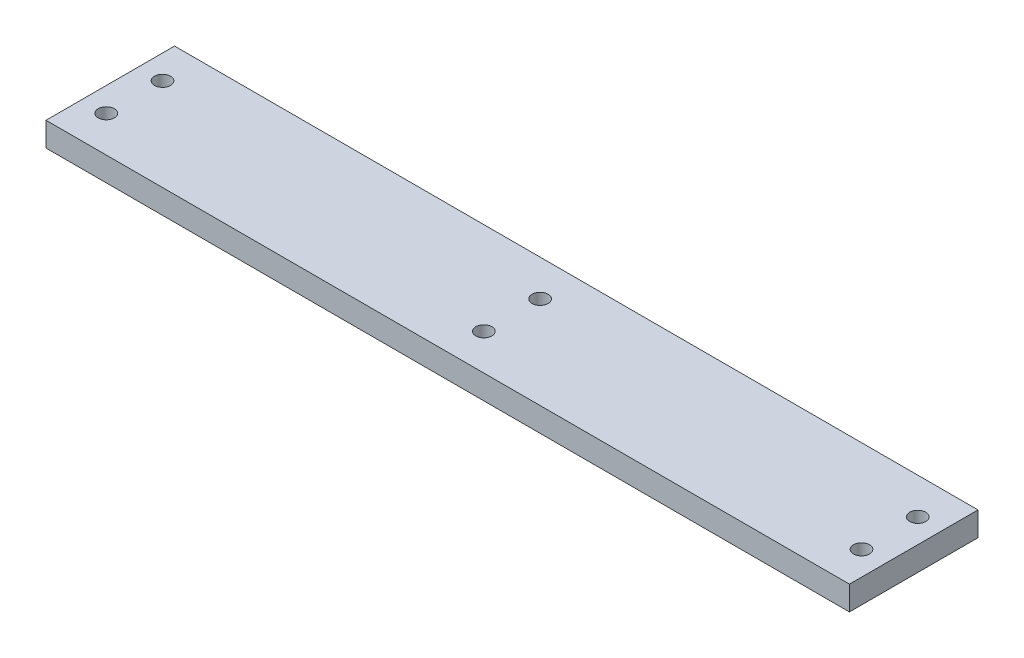
ISO-10303-21;
HEADER;
FILE_DESCRIPTION(('STEP AP214'),'2;1');
FILE_NAME('part.step','',(''),(''),'','','');
FILE_SCHEMA(('AUTOMOTIVE_DESIGN { 1 0 10303 214 1 1 1 1 }'));
ENDSEC;
DATA;
#1=APPLICATION_CONTEXT('core data for automotive mechanical design processes');
#2=APPLICATION_PROTOCOL_DEFINITION('international standard','automotive_design',2000,#1);
#3=PRODUCT_CONTEXT('',#1,'mechanical');
#4=PRODUCT('Part','Part','',(#3));
#5=PRODUCT_RELATED_PRODUCT_CATEGORY('part','',(#4));
#6=PRODUCT_DEFINITION_FORMATION('','',#4);
#7=PRODUCT_DEFINITION_CONTEXT('part definition',#1,'design');
#8=PRODUCT_DEFINITION('design','',#6,#7);
#9=PRODUCT_DEFINITION_SHAPE('','',#8);
#10=(LENGTH_UNIT() NAMED_UNIT(*) SI_UNIT(.MILLI.,.METRE.));
#11=(NAMED_UNIT(*) PLANE_ANGLE_UNIT() SI_UNIT($,.RADIAN.));
#12=(NAMED_UNIT(*) SI_UNIT($,.STERADIAN.) SOLID_ANGLE_UNIT());
#13=UNCERTAINTY_MEASURE_WITH_UNIT(LENGTH_MEASURE(1.E-05),#10,'distance_accuracy_value','');
#14=(GEOMETRIC_REPRESENTATION_CONTEXT(3) GLOBAL_UNCERTAINTY_ASSIGNED_CONTEXT((#13)) GLOBAL_UNIT_ASSIGNED_CONTEXT((#10,
#11,#12)) REPRESENTATION_CONTEXT('',''));
#15=CARTESIAN_POINT('',(0.,0.,0.));
#16=DIRECTION('',(0.,0.,1.));
#17=DIRECTION('',(1.,0.,0.));
#18=AXIS2_PLACEMENT_3D('',#15,#16,#17);
#19=CARTESIAN_POINT('',(50.,3.,8.));
#20=DIRECTION('',(-1.,0.,0.));
#21=DIRECTION('',(0.,0.,1.));
#22=AXIS2_PLACEMENT_3D('',#19,#20,#21);
#23=PLANE('',#22);
#24=DIRECTION('',(0.,0.,-1.));
#25=VECTOR('',#24,1.);
#26=CARTESIAN_POINT('',(50.,0.,8.));
#27=LINE('',#26,#25);
#28=CARTESIAN_POINT('',(50.,0.,8.));
#29=VERTEX_POINT('',#28);
#30=CARTESIAN_POINT('',(50.,0.,-8.));
#31=VERTEX_POINT('',#30);
#32=EDGE_CURVE('E97',#29,#31,#27,.T.);
#33=ORIENTED_EDGE('',*,*,#32,.T.);
#34=DIRECTION('',(0.,-1.,0.));
#35=VECTOR('',#34,1.);
#36=CARTESIAN_POINT('',(50.,3.,-8.));
#37=LINE('',#36,#35);
#38=CARTESIAN_POINT('',(50.,3.,-8.));
#39=VERTEX_POINT('',#38);
#40=EDGE_CURVE('E11',#39,#31,#37,.T.);
#41=ORIENTED_EDGE('',*,*,#40,.F.);
#42=DIRECTION('',(0.,0.,-1.));
#43=VECTOR('',#42,1.);
#44=CARTESIAN_POINT('',(50.,3.,8.));
#45=LINE('',#44,#43);
#46=CARTESIAN_POINT('',(50.,3.,8.));
#47=VERTEX_POINT('',#46);
#48=EDGE_CURVE('E85',#47,#39,#45,.T.);
#49=ORIENTED_EDGE('',*,*,#48,.F.);
#50=DIRECTION('',(0.,-1.,0.));
#51=VECTOR('',#50,1.);
#52=CARTESIAN_POINT('',(50.,3.,8.));
#53=LINE('',#52,#51);
#54=EDGE_CURVE('E93',#47,#29,#53,.T.);
#55=ORIENTED_EDGE('',*,*,#54,.T.);
#56=EDGE_LOOP('',(#33,#41,#49,#55));
#57=FACE_BOUND('',#56,.T.);
#58=ADVANCED_FACE('F34',(#57),#23,.F.);
#59=CARTESIAN_POINT('',(-50.,3.,-8.));
#60=DIRECTION('',(0.,0.,1.));
#61=DIRECTION('',(1.,0.,0.));
#62=AXIS2_PLACEMENT_3D('',#59,#60,#61);
#63=PLANE('',#62);
#64=DIRECTION('',(-1.,0.,0.));
#65=VECTOR('',#64,1.);
#66=CARTESIAN_POINT('',(-50.,0.,-8.));
#67=LINE('',#66,#65);
#68=CARTESIAN_POINT('',(-50.,0.,-8.));
#69=VERTEX_POINT('',#68);
#70=EDGE_CURVE('E89',#31,#69,#67,.T.);
#71=ORIENTED_EDGE('',*,*,#70,.T.);
#72=DIRECTION('',(0.,-1.,0.));
#73=VECTOR('',#72,1.);
#74=CARTESIAN_POINT('',(-50.,3.,-8.));
#75=LINE('',#74,#73);
#76=CARTESIAN_POINT('',(-50.,3.,-8.));
#77=VERTEX_POINT('',#76);
#78=EDGE_CURVE('E42',#77,#69,#75,.T.);
#79=ORIENTED_EDGE('',*,*,#78,.F.);
#80=DIRECTION('',(-1.,0.,0.));
#81=VECTOR('',#80,1.);
#82=CARTESIAN_POINT('',(-50.,3.,-8.));
#83=LINE('',#82,#81);
#84=EDGE_CURVE('E80',#39,#77,#83,.T.);
#85=ORIENTED_EDGE('',*,*,#84,.F.);
#86=ORIENTED_EDGE('',*,*,#40,.T.);
#87=EDGE_LOOP('',(#71,#79,#85,#86));
#88=FACE_BOUND('',#87,.T.);
#89=ADVANCED_FACE('F88',(#88),#63,.F.);
#90=CARTESIAN_POINT('',(-50.,3.,8.));
#91=DIRECTION('',(1.,0.,0.));
#92=DIRECTION('',(0.,0.,-1.));
#93=AXIS2_PLACEMENT_3D('',#90,#91,#92);
#94=PLANE('',#93);
#95=DIRECTION('',(0.,0.,1.));
#96=VECTOR('',#95,1.);
#97=CARTESIAN_POINT('',(-50.,0.,8.));
#98=LINE('',#97,#96);
#99=CARTESIAN_POINT('',(-50.,0.,8.));
#100=VERTEX_POINT('',#99);
#101=EDGE_CURVE('E67',#69,#100,#98,.T.);
#102=ORIENTED_EDGE('',*,*,#101,.T.);
#103=DIRECTION('',(0.,-1.,0.));
#104=VECTOR('',#103,1.);
#105=CARTESIAN_POINT('',(-50.,3.,8.));
#106=LINE('',#105,#104);
#107=CARTESIAN_POINT('',(-50.,3.,8.));
#108=VERTEX_POINT('',#107);
#109=EDGE_CURVE('E90',#108,#100,#106,.T.);
#110=ORIENTED_EDGE('',*,*,#109,.F.);
#111=DIRECTION('',(0.,0.,1.));
#112=VECTOR('',#111,1.);
#113=CARTESIAN_POINT('',(-50.,3.,8.));
#114=LINE('',#113,#112);
#115=EDGE_CURVE('E83',#77,#108,#114,.T.);
#116=ORIENTED_EDGE('',*,*,#115,.F.);
#117=ORIENTED_EDGE('',*,*,#78,.T.);
#118=EDGE_LOOP('',(#102,#110,#116,#117));
#119=FACE_BOUND('',#118,.T.);
#120=ADVANCED_FACE('F91',(#119),#94,.F.);
#121=CARTESIAN_POINT('',(-50.,3.,8.));
#122=DIRECTION('',(0.,0.,-1.));
#123=DIRECTION('',(-1.,0.,0.));
#124=AXIS2_PLACEMENT_3D('',#121,#122,#123);
#125=PLANE('',#124);
#126=DIRECTION('',(1.,0.,0.));
#127=VECTOR('',#126,1.);
#128=CARTESIAN_POINT('',(-50.,0.,8.));
#129=LINE('',#128,#127);
#130=EDGE_CURVE('E73',#100,#29,#129,.T.);
#131=ORIENTED_EDGE('',*,*,#130,.T.);
#132=ORIENTED_EDGE('',*,*,#54,.F.);
#133=DIRECTION('',(1.,0.,0.));
#134=VECTOR('',#133,1.);
#135=CARTESIAN_POINT('',(-50.,3.,8.));
#136=LINE('',#135,#134);
#137=EDGE_CURVE('E50',#108,#47,#136,.T.);
#138=ORIENTED_EDGE('',*,*,#137,.F.);
#139=ORIENTED_EDGE('',*,*,#109,.T.);
#140=EDGE_LOOP('',(#131,#132,#138,#139));
#141=FACE_BOUND('',#140,.T.);
#142=ADVANCED_FACE('F105',(#141),#125,.F.);
#143=CARTESIAN_POINT('',(0.,3.,0.));
#144=DIRECTION('',(0.,-1.,0.));
#145=DIRECTION('',(0.,0.,-1.));
#146=AXIS2_PLACEMENT_3D('',#143,#144,#145);
#147=PLANE('',#146);
#148=CARTESIAN_POINT('',(0.,3.,-3.49999999999647));
#149=DIRECTION('',(0.,1.,0.));
#150=DIRECTION('',(0.,0.,1.));
#151=AXIS2_PLACEMENT_3D('',#148,#149,#150);
#152=CIRCLE('',#151,0.999999999999998);
#153=CARTESIAN_POINT('',(0.,3.,-2.49999999999647));
#154=VERTEX_POINT('',#153);
#155=EDGE_CURVE('E136',#154,#154,#152,.T.);
#156=ORIENTED_EDGE('',*,*,#155,.F.);
#157=EDGE_LOOP('',(#156));
#158=FACE_BOUND('',#157,.T.);
#159=CARTESIAN_POINT('',(-47.,3.,-3.49999999999614));
#160=DIRECTION('',(0.,1.,0.));
#161=DIRECTION('',(0.,0.,1.));
#162=AXIS2_PLACEMENT_3D('',#159,#160,#161);
#163=CIRCLE('',#162,0.999999999999998);
#164=CARTESIAN_POINT('',(-47.,3.,-2.49999999999614));
#165=VERTEX_POINT('',#164);
#166=EDGE_CURVE('E130',#165,#165,#163,.T.);
#167=ORIENTED_EDGE('',*,*,#166,.F.);
#168=EDGE_LOOP('',(#167));
#169=FACE_BOUND('',#168,.T.);
#170=CARTESIAN_POINT('',(47.,3.,3.49999999999667));
#171=DIRECTION('',(0.,1.,0.));
#172=DIRECTION('',(0.,0.,-1.));
#173=AXIS2_PLACEMENT_3D('',#170,#171,#172);
#174=CIRCLE('',#173,0.999999999999998);
#175=CARTESIAN_POINT('',(47.,3.,2.49999999999668));
#176=VERTEX_POINT('',#175);
#177=EDGE_CURVE('E124',#176,#176,#174,.T.);
#178=ORIENTED_EDGE('',*,*,#177,.F.);
#179=EDGE_LOOP('',(#178));
#180=FACE_BOUND('',#179,.T.);
#181=CARTESIAN_POINT('',(0.,3.,3.49999999999635));
#182=DIRECTION('',(0.,1.,0.));
#183=DIRECTION('',(0.,0.,-1.));
#184=AXIS2_PLACEMENT_3D('',#181,#182,#183);
#185=CIRCLE('',#184,0.999999999999998);
#186=CARTESIAN_POINT('',(0.,3.,2.49999999999635));
#187=VERTEX_POINT('',#186);
#188=EDGE_CURVE('E117',#187,#187,#185,.T.);
#189=ORIENTED_EDGE('',*,*,#188,.F.);
#190=EDGE_LOOP('',(#189));
#191=FACE_BOUND('',#190,.T.);
#192=CARTESIAN_POINT('',(-47.,3.,3.49999999999602));
#193=DIRECTION('',(0.,1.,0.));
#194=DIRECTION('',(0.,0.,-1.));
#195=AXIS2_PLACEMENT_3D('',#192,#193,#194);
#196=CIRCLE('',#195,0.999999999999998);
#197=CARTESIAN_POINT('',(-47.,3.,2.49999999999602));
#198=VERTEX_POINT('',#197);
#199=EDGE_CURVE('E141',#198,#198,#196,.T.);
#200=ORIENTED_EDGE('',*,*,#199,.F.);
#201=EDGE_LOOP('',(#200));
#202=FACE_BOUND('',#201,.T.);
#203=CARTESIAN_POINT('',(47.,3.,-3.4999999999968));
#204=DIRECTION('',(0.,1.,0.));
#205=DIRECTION('',(0.,0.,1.));
#206=AXIS2_PLACEMENT_3D('',#203,#204,#205);
#207=CIRCLE('',#206,0.999999999999998);
#208=CARTESIAN_POINT('',(47.,3.,-2.4999999999968));
#209=VERTEX_POINT('',#208);
#210=EDGE_CURVE('E111',#209,#209,#207,.T.);
#211=ORIENTED_EDGE('',*,*,#210,.F.);
#212=EDGE_LOOP('',(#211));
#213=FACE_BOUND('',#212,.T.);
#214=ORIENTED_EDGE('',*,*,#48,.T.);
#215=ORIENTED_EDGE('',*,*,#84,.T.);
#216=ORIENTED_EDGE('',*,*,#115,.T.);
#217=ORIENTED_EDGE('',*,*,#137,.T.);
#218=EDGE_LOOP('',(#214,#215,#216,#217));
#219=FACE_BOUND('',#218,.T.);
#220=ADVANCED_FACE('F81',(#158,#169,#180,#191,#202,#213,#219),#147,.F.);
#221=CARTESIAN_POINT('',(0.,0.,0.));
#222=DIRECTION('',(0.,-1.,0.));
#223=DIRECTION('',(0.,0.,-1.));
#224=AXIS2_PLACEMENT_3D('',#221,#222,#223);
#225=PLANE('',#224);
#226=CARTESIAN_POINT('',(0.,0.,-3.49999999999647));
#227=DIRECTION('',(0.,1.,0.));
#228=DIRECTION('',(0.,0.,1.));
#229=AXIS2_PLACEMENT_3D('',#226,#227,#228);
#230=CIRCLE('',#229,0.999999999999998);
#231=CARTESIAN_POINT('',(0.,0.,-2.49999999999647));
#232=VERTEX_POINT('',#231);
#233=EDGE_CURVE('E114',#232,#232,#230,.T.);
#234=ORIENTED_EDGE('',*,*,#233,.T.);
#235=EDGE_LOOP('',(#234));
#236=FACE_BOUND('',#235,.T.);
#237=CARTESIAN_POINT('',(-47.,0.,-3.49999999999614));
#238=DIRECTION('',(0.,1.,0.));
#239=DIRECTION('',(0.,0.,1.));
#240=AXIS2_PLACEMENT_3D('',#237,#238,#239);
#241=CIRCLE('',#240,0.999999999999998);
#242=CARTESIAN_POINT('',(-47.,0.,-2.49999999999614));
#243=VERTEX_POINT('',#242);
#244=EDGE_CURVE('E133',#243,#243,#241,.T.);
#245=ORIENTED_EDGE('',*,*,#244,.T.);
#246=EDGE_LOOP('',(#245));
#247=FACE_BOUND('',#246,.T.);
#248=CARTESIAN_POINT('',(47.,0.,3.49999999999667));
#249=DIRECTION('',(0.,1.,0.));
#250=DIRECTION('',(0.,0.,-1.));
#251=AXIS2_PLACEMENT_3D('',#248,#249,#250);
#252=CIRCLE('',#251,0.999999999999998);
#253=CARTESIAN_POINT('',(47.,0.,2.49999999999668));
#254=VERTEX_POINT('',#253);
#255=EDGE_CURVE('E127',#254,#254,#252,.T.);
#256=ORIENTED_EDGE('',*,*,#255,.T.);
#257=EDGE_LOOP('',(#256));
#258=FACE_BOUND('',#257,.T.);
#259=CARTESIAN_POINT('',(0.,0.,3.49999999999635));
#260=DIRECTION('',(0.,1.,0.));
#261=DIRECTION('',(0.,0.,-1.));
#262=AXIS2_PLACEMENT_3D('',#259,#260,#261);
#263=CIRCLE('',#262,0.999999999999998);
#264=CARTESIAN_POINT('',(0.,0.,2.49999999999635));
#265=VERTEX_POINT('',#264);
#266=EDGE_CURVE('E120',#265,#265,#263,.T.);
#267=ORIENTED_EDGE('',*,*,#266,.T.);
#268=EDGE_LOOP('',(#267));
#269=FACE_BOUND('',#268,.T.);
#270=CARTESIAN_POINT('',(-47.,0.,3.49999999999602));
#271=DIRECTION('',(0.,1.,0.));
#272=DIRECTION('',(0.,0.,-1.));
#273=AXIS2_PLACEMENT_3D('',#270,#271,#272);
#274=CIRCLE('',#273,0.999999999999998);
#275=CARTESIAN_POINT('',(-47.,0.,2.49999999999602));
#276=VERTEX_POINT('',#275);
#277=EDGE_CURVE('E121',#276,#276,#274,.T.);
#278=ORIENTED_EDGE('',*,*,#277,.T.);
#279=EDGE_LOOP('',(#278));
#280=FACE_BOUND('',#279,.T.);
#281=CARTESIAN_POINT('',(47.,0.,-3.4999999999968));
#282=DIRECTION('',(0.,1.,0.));
#283=DIRECTION('',(0.,0.,1.));
#284=AXIS2_PLACEMENT_3D('',#281,#282,#283);
#285=CIRCLE('',#284,0.999999999999998);
#286=CARTESIAN_POINT('',(47.,0.,-2.4999999999968));
#287=VERTEX_POINT('',#286);
#288=EDGE_CURVE('E100',#287,#287,#285,.T.);
#289=ORIENTED_EDGE('',*,*,#288,.T.);
#290=EDGE_LOOP('',(#289));
#291=FACE_BOUND('',#290,.T.);
#292=ORIENTED_EDGE('',*,*,#32,.F.);
#293=ORIENTED_EDGE('',*,*,#130,.F.);
#294=ORIENTED_EDGE('',*,*,#101,.F.);
#295=ORIENTED_EDGE('',*,*,#70,.F.);
#296=EDGE_LOOP('',(#292,#293,#294,#295));
#297=FACE_BOUND('',#296,.T.);
#298=ADVANCED_FACE('F108',(#236,#247,#258,#269,#280,#291,#297),#225,.T.);
#299=CARTESIAN_POINT('',(47.,0.,-3.4999999999968));
#300=DIRECTION('',(0.,1.,0.));
#301=DIRECTION('',(0.,0.,1.));
#302=AXIS2_PLACEMENT_3D('',#299,#300,#301);
#303=CYLINDRICAL_SURFACE('',#302,0.999999999999998);
#304=ORIENTED_EDGE('',*,*,#288,.F.);
#305=EDGE_LOOP('',(#304));
#306=FACE_BOUND('',#305,.T.);
#307=ORIENTED_EDGE('',*,*,#210,.T.);
#308=EDGE_LOOP('',(#307));
#309=FACE_BOUND('',#308,.T.);
#310=ADVANCED_FACE('F153',(#306,#309),#303,.F.);
#311=CARTESIAN_POINT('',(-47.,0.,3.49999999999602));
#312=DIRECTION('',(0.,1.,0.));
#313=DIRECTION('',(0.,0.,1.));
#314=AXIS2_PLACEMENT_3D('',#311,#312,#313);
#315=CYLINDRICAL_SURFACE('',#314,0.999999999999998);
#316=ORIENTED_EDGE('',*,*,#277,.F.);
#317=EDGE_LOOP('',(#316));
#318=FACE_BOUND('',#317,.T.);
#319=ORIENTED_EDGE('',*,*,#199,.T.);
#320=EDGE_LOOP('',(#319));
#321=FACE_BOUND('',#320,.T.);
#322=ADVANCED_FACE('F149',(#318,#321),#315,.F.);
#323=CARTESIAN_POINT('',(0.,0.,3.49999999999635));
#324=DIRECTION('',(0.,1.,0.));
#325=DIRECTION('',(0.,0.,1.));
#326=AXIS2_PLACEMENT_3D('',#323,#324,#325);
#327=CYLINDRICAL_SURFACE('',#326,0.999999999999998);
#328=ORIENTED_EDGE('',*,*,#266,.F.);
#329=EDGE_LOOP('',(#328));
#330=FACE_BOUND('',#329,.T.);
#331=ORIENTED_EDGE('',*,*,#188,.T.);
#332=EDGE_LOOP('',(#331));
#333=FACE_BOUND('',#332,.T.);
#334=ADVANCED_FACE('F152',(#330,#333),#327,.F.);
#335=CARTESIAN_POINT('',(47.,0.,3.49999999999667));
#336=DIRECTION('',(0.,1.,0.));
#337=DIRECTION('',(0.,0.,1.));
#338=AXIS2_PLACEMENT_3D('',#335,#336,#337);
#339=CYLINDRICAL_SURFACE('',#338,0.999999999999998);
#340=ORIENTED_EDGE('',*,*,#255,.F.);
#341=EDGE_LOOP('',(#340));
#342=FACE_BOUND('',#341,.T.);
#343=ORIENTED_EDGE('',*,*,#177,.T.);
#344=EDGE_LOOP('',(#343));
#345=FACE_BOUND('',#344,.T.);
#346=ADVANCED_FACE('F214',(#342,#345),#339,.F.);
#347=CARTESIAN_POINT('',(-47.,0.,-3.49999999999614));
#348=DIRECTION('',(0.,1.,0.));
#349=DIRECTION('',(0.,0.,1.));
#350=AXIS2_PLACEMENT_3D('',#347,#348,#349);
#351=CYLINDRICAL_SURFACE('',#350,0.999999999999998);
#352=ORIENTED_EDGE('',*,*,#244,.F.);
#353=EDGE_LOOP('',(#352));
#354=FACE_BOUND('',#353,.T.);
#355=ORIENTED_EDGE('',*,*,#166,.T.);
#356=EDGE_LOOP('',(#355));
#357=FACE_BOUND('',#356,.T.);
#358=ADVANCED_FACE('F223',(#354,#357),#351,.F.);
#359=CARTESIAN_POINT('',(0.,0.,-3.49999999999647));
#360=DIRECTION('',(0.,1.,0.));
#361=DIRECTION('',(0.,0.,1.));
#362=AXIS2_PLACEMENT_3D('',#359,#360,#361);
#363=CYLINDRICAL_SURFACE('',#362,0.999999999999998);
#364=ORIENTED_EDGE('',*,*,#233,.F.);
#365=EDGE_LOOP('',(#364));
#366=FACE_BOUND('',#365,.T.);
#367=ORIENTED_EDGE('',*,*,#155,.T.);
#368=EDGE_LOOP('',(#367));
#369=FACE_BOUND('',#368,.T.);
#370=ADVANCED_FACE('F233',(#366,#369),#363,.F.);
#371=CLOSED_SHELL('',(#58,#89,#120,#142,#220,#298,#310,#322,#334,#346,#358,#370));
#372=MANIFOLD_SOLID_BREP('B2',#371);
#373=ADVANCED_BREP_SHAPE_REPRESENTATION('',(#18,#372),#14);
#374=SHAPE_DEFINITION_REPRESENTATION(#9,#373);
ENDSEC;
END-ISO-10303-21;
